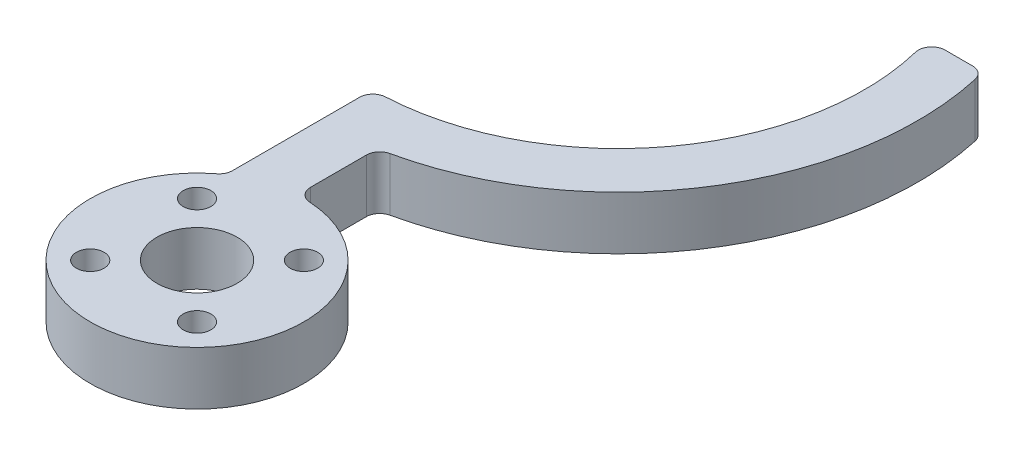
ISO-10303-21;
HEADER;
FILE_DESCRIPTION(('STEP AP214'),'2;1');
FILE_NAME('part.step','',(''),(''),'','','');
FILE_SCHEMA(('AUTOMOTIVE_DESIGN { 1 0 10303 214 1 1 1 1 }'));
ENDSEC;
DATA;
#1=APPLICATION_CONTEXT('core data for automotive mechanical design processes');
#2=APPLICATION_PROTOCOL_DEFINITION('international standard','automotive_design',2000,#1);
#3=PRODUCT_CONTEXT('',#1,'mechanical');
#4=PRODUCT('Part','Part','',(#3));
#5=PRODUCT_RELATED_PRODUCT_CATEGORY('part','',(#4));
#6=PRODUCT_DEFINITION_FORMATION('','',#4);
#7=PRODUCT_DEFINITION_CONTEXT('part definition',#1,'design');
#8=PRODUCT_DEFINITION('design','',#6,#7);
#9=PRODUCT_DEFINITION_SHAPE('','',#8);
#10=(LENGTH_UNIT() NAMED_UNIT(*) SI_UNIT(.MILLI.,.METRE.));
#11=(NAMED_UNIT(*) PLANE_ANGLE_UNIT() SI_UNIT($,.RADIAN.));
#12=(NAMED_UNIT(*) SI_UNIT($,.STERADIAN.) SOLID_ANGLE_UNIT());
#13=UNCERTAINTY_MEASURE_WITH_UNIT(LENGTH_MEASURE(1.E-05),#10,'distance_accuracy_value','');
#14=(GEOMETRIC_REPRESENTATION_CONTEXT(3) GLOBAL_UNCERTAINTY_ASSIGNED_CONTEXT((#13)) GLOBAL_UNIT_ASSIGNED_CONTEXT((#10,
#11,#12)) REPRESENTATION_CONTEXT('',''));
#15=CARTESIAN_POINT('',(0.,0.,0.));
#16=DIRECTION('',(0.,0.,1.));
#17=DIRECTION('',(1.,0.,0.));
#18=AXIS2_PLACEMENT_3D('',#15,#16,#17);
#19=CARTESIAN_POINT('',(8.96696536966746,8.,72.0811709693591));
#20=DIRECTION('',(0.,-1.,0.));
#21=DIRECTION('',(0.,0.,-1.));
#22=AXIS2_PLACEMENT_3D('',#19,#20,#21);
#23=CYLINDRICAL_SURFACE('',#22,16.);
#24=CARTESIAN_POINT('',(8.96696536966746,0.,72.0811709693591));
#25=DIRECTION('',(0.,1.,0.));
#26=DIRECTION('',(0.,0.,1.));
#27=AXIS2_PLACEMENT_3D('',#24,#25,#26);
#28=CIRCLE('',#27,16.);
#29=CARTESIAN_POINT('',(-0.781448292259167,0.,59.3938374797734));
#30=VERTEX_POINT('',#29);
#31=CARTESIAN_POINT('',(9.8852183744075,0.,56.1075423453023));
#32=VERTEX_POINT('',#31);
#33=EDGE_CURVE('E159',#30,#32,#28,.T.);
#34=ORIENTED_EDGE('',*,*,#33,.T.);
#35=DIRECTION('',(0.,-1.,0.));
#36=VECTOR('',#35,1.);
#37=CARTESIAN_POINT('',(9.8852183744075,8.,56.1075423453023));
#38=LINE('',#37,#36);
#39=CARTESIAN_POINT('',(9.8852183744075,8.,56.1075423453023));
#40=VERTEX_POINT('',#39);
#41=EDGE_CURVE('E180',#32,#40,#38,.F.);
#42=ORIENTED_EDGE('',*,*,#41,.T.);
#43=CARTESIAN_POINT('',(8.96696536966746,8.,72.0811709693591));
#44=DIRECTION('',(0.,1.,0.));
#45=DIRECTION('',(0.,0.,1.));
#46=AXIS2_PLACEMENT_3D('',#43,#44,#45);
#47=CIRCLE('',#46,16.);
#48=CARTESIAN_POINT('',(-0.781448292259167,8.,59.3938374797734));
#49=VERTEX_POINT('',#48);
#50=EDGE_CURVE('E284',#49,#40,#47,.T.);
#51=ORIENTED_EDGE('',*,*,#50,.F.);
#52=DIRECTION('',(0.,-1.,0.));
#53=VECTOR('',#52,1.);
#54=CARTESIAN_POINT('',(-0.781448292259167,8.,59.3938374797734));
#55=LINE('',#54,#53);
#56=EDGE_CURVE('E168',#49,#30,#55,.T.);
#57=ORIENTED_EDGE('',*,*,#56,.T.);
#58=EDGE_LOOP('',(#34,#42,#51,#57));
#59=FACE_BOUND('',#58,.T.);
#60=ADVANCED_FACE('F44',(#59),#23,.T.);
#61=CARTESIAN_POINT('',(8.00000000000002,8.,0.));
#62=DIRECTION('',(1.,0.,0.));
#63=DIRECTION('',(0.,0.,-1.));
#64=AXIS2_PLACEMENT_3D('',#61,#62,#63);
#65=PLANE('',#64);
#66=DIRECTION('',(0.,0.,1.));
#67=VECTOR('',#66,1.);
#68=CARTESIAN_POINT('',(8.00000000000002,8.,0.));
#69=LINE('',#68,#67);
#70=CARTESIAN_POINT('',(8.,8.,45.7498513658788));
#71=VERTEX_POINT('',#70);
#72=CARTESIAN_POINT('',(8.,8.,54.1108387672952));
#73=VERTEX_POINT('',#72);
#74=EDGE_CURVE('E288',#71,#73,#69,.T.);
#75=ORIENTED_EDGE('',*,*,#74,.T.);
#76=DIRECTION('',(0.,-1.,0.));
#77=VECTOR('',#76,1.);
#78=CARTESIAN_POINT('',(8.,8.,54.1108387672952));
#79=LINE('',#78,#77);
#80=CARTESIAN_POINT('',(8.,0.,54.1108387672952));
#81=VERTEX_POINT('',#80);
#82=EDGE_CURVE('E157',#73,#81,#79,.T.);
#83=ORIENTED_EDGE('',*,*,#82,.T.);
#84=DIRECTION('',(0.,0.,1.));
#85=VECTOR('',#84,1.);
#86=CARTESIAN_POINT('',(8.00000000000002,0.,0.));
#87=LINE('',#86,#85);
#88=CARTESIAN_POINT('',(8.,0.,45.7498513658788));
#89=VERTEX_POINT('',#88);
#90=EDGE_CURVE('E139',#89,#81,#87,.T.);
#91=ORIENTED_EDGE('',*,*,#90,.F.);
#92=DIRECTION('',(0.,-1.,0.));
#93=VECTOR('',#92,1.);
#94=CARTESIAN_POINT('',(8.,8.,45.7498513658788));
#95=LINE('',#94,#93);
#96=EDGE_CURVE('E154',#89,#71,#95,.F.);
#97=ORIENTED_EDGE('',*,*,#96,.T.);
#98=EDGE_LOOP('',(#75,#83,#91,#97));
#99=FACE_BOUND('',#98,.T.);
#100=ADVANCED_FACE('F153',(#99),#65,.T.);
#101=CARTESIAN_POINT('',(0.,8.,0.));
#102=DIRECTION('',(0.,-1.,0.));
#103=DIRECTION('',(0.,0.,-1.));
#104=AXIS2_PLACEMENT_3D('',#101,#102,#103);
#105=CYLINDRICAL_SURFACE('',#104,44.83);
#106=CARTESIAN_POINT('',(0.,0.,0.));
#107=DIRECTION('',(0.,1.,0.));
#108=DIRECTION('',(0.,0.,1.));
#109=AXIS2_PLACEMENT_3D('',#106,#107,#108);
#110=CIRCLE('',#109,44.83);
#111=CARTESIAN_POINT('',(9.57292333973949,0.,43.7959819930033));
#112=VERTEX_POINT('',#111);
#113=CARTESIAN_POINT('',(43.7826288002551,0.,-9.6338110495835));
#114=VERTEX_POINT('',#113);
#115=EDGE_CURVE('E141',#112,#114,#110,.T.);
#116=ORIENTED_EDGE('',*,*,#115,.T.);
#117=DIRECTION('',(0.,-1.,0.));
#118=VECTOR('',#117,1.);
#119=CARTESIAN_POINT('',(43.7826288002551,8.,-9.63381104958349));
#120=LINE('',#119,#118);
#121=CARTESIAN_POINT('',(43.7826288002551,8.,-9.6338110495835));
#122=VERTEX_POINT('',#121);
#123=EDGE_CURVE('E218',#114,#122,#120,.F.);
#124=ORIENTED_EDGE('',*,*,#123,.T.);
#125=CARTESIAN_POINT('',(0.,8.,0.));
#126=DIRECTION('',(0.,1.,0.));
#127=DIRECTION('',(0.,0.,1.));
#128=AXIS2_PLACEMENT_3D('',#125,#126,#127);
#129=CIRCLE('',#128,44.83);
#130=CARTESIAN_POINT('',(9.57292333973949,8.,43.7959819930033));
#131=VERTEX_POINT('',#130);
#132=EDGE_CURVE('E253',#131,#122,#129,.T.);
#133=ORIENTED_EDGE('',*,*,#132,.F.);
#134=DIRECTION('',(0.,-1.,0.));
#135=VECTOR('',#134,1.);
#136=CARTESIAN_POINT('',(9.57292333973949,8.,43.7959819930033));
#137=LINE('',#136,#135);
#138=EDGE_CURVE('E183',#131,#112,#137,.T.);
#139=ORIENTED_EDGE('',*,*,#138,.T.);
#140=EDGE_LOOP('',(#116,#124,#133,#139));
#141=FACE_BOUND('',#140,.T.);
#142=ADVANCED_FACE('F241',(#141),#105,.T.);
#143=CARTESIAN_POINT('',(0.,8.,0.));
#144=DIRECTION('',(0.,-1.,0.));
#145=DIRECTION('',(0.,0.,-1.));
#146=AXIS2_PLACEMENT_3D('',#143,#144,#145);
#147=CYLINDRICAL_SURFACE('',#146,36.83);
#148=CARTESIAN_POINT('',(0.,8.,0.));
#149=DIRECTION('',(0.,1.,0.));
#150=DIRECTION('',(0.,0.,1.));
#151=AXIS2_PLACEMENT_3D('',#148,#149,#150);
#152=CIRCLE('',#151,36.83);
#153=CARTESIAN_POINT('',(1.8969868658254,8.,36.7811139150364));
#154=VERTEX_POINT('',#153);
#155=CARTESIAN_POINT('',(35.7803977324483,8.,-8.72995063604655));
#156=VERTEX_POINT('',#155);
#157=EDGE_CURVE('E171',#154,#156,#152,.T.);
#158=ORIENTED_EDGE('',*,*,#157,.T.);
#159=DIRECTION('',(0.,-1.,0.));
#160=VECTOR('',#159,1.);
#161=CARTESIAN_POINT('',(35.7803977324483,8.,-8.72995063604655));
#162=LINE('',#161,#160);
#163=CARTESIAN_POINT('',(35.7803977324483,0.,-8.72995063604655));
#164=VERTEX_POINT('',#163);
#165=EDGE_CURVE('E11',#156,#164,#162,.T.);
#166=ORIENTED_EDGE('',*,*,#165,.T.);
#167=CARTESIAN_POINT('',(0.,0.,0.));
#168=DIRECTION('',(0.,1.,0.));
#169=DIRECTION('',(0.,0.,1.));
#170=AXIS2_PLACEMENT_3D('',#167,#168,#169);
#171=CIRCLE('',#170,36.83);
#172=CARTESIAN_POINT('',(1.8969868658254,0.,36.7811139150364));
#173=VERTEX_POINT('',#172);
#174=EDGE_CURVE('E245',#173,#164,#171,.T.);
#175=ORIENTED_EDGE('',*,*,#174,.F.);
#176=DIRECTION('',(0.,-1.,0.));
#177=VECTOR('',#176,1.);
#178=CARTESIAN_POINT('',(1.8969868658254,8.,36.7811139150364));
#179=LINE('',#178,#177);
#180=EDGE_CURVE('E196',#173,#154,#179,.F.);
#181=ORIENTED_EDGE('',*,*,#180,.T.);
#182=EDGE_LOOP('',(#158,#166,#175,#181));
#183=FACE_BOUND('',#182,.T.);
#184=ADVANCED_FACE('F356',(#183),#147,.F.);
#185=CARTESIAN_POINT('',(0.966965369667458,8.,80.0811709693591));
#186=DIRECTION('',(0.,-1.,0.));
#187=DIRECTION('',(0.,0.,-1.));
#188=AXIS2_PLACEMENT_3D('',#185,#186,#187);
#189=CYLINDRICAL_SURFACE('',#188,2.07500000000001);
#190=CARTESIAN_POINT('',(0.966965369667458,8.,80.0811709693591));
#191=DIRECTION('',(0.,1.,0.));
#192=DIRECTION('',(0.,0.,1.));
#193=AXIS2_PLACEMENT_3D('',#190,#191,#192);
#194=CIRCLE('',#193,2.07500000000001);
#195=CARTESIAN_POINT('',(0.966965369667458,8.,82.1561709693591));
#196=VERTEX_POINT('',#195);
#197=EDGE_CURVE('E280',#196,#196,#194,.T.);
#198=ORIENTED_EDGE('',*,*,#197,.T.);
#199=EDGE_LOOP('',(#198));
#200=FACE_BOUND('',#199,.T.);
#201=CARTESIAN_POINT('',(0.966965369667458,0.,80.0811709693591));
#202=DIRECTION('',(0.,1.,0.));
#203=DIRECTION('',(0.,0.,1.));
#204=AXIS2_PLACEMENT_3D('',#201,#202,#203);
#205=CIRCLE('',#204,2.07500000000001);
#206=CARTESIAN_POINT('',(0.966965369667458,0.,82.1561709693591));
#207=VERTEX_POINT('',#206);
#208=EDGE_CURVE('E306',#207,#207,#205,.T.);
#209=ORIENTED_EDGE('',*,*,#208,.F.);
#210=EDGE_LOOP('',(#209));
#211=FACE_BOUND('',#210,.T.);
#212=ADVANCED_FACE('F352',(#200,#211),#189,.F.);
#213=CARTESIAN_POINT('',(16.9669653696675,8.,80.0811709693591));
#214=DIRECTION('',(0.,-1.,0.));
#215=DIRECTION('',(0.,0.,-1.));
#216=AXIS2_PLACEMENT_3D('',#213,#214,#215);
#217=CYLINDRICAL_SURFACE('',#216,2.07500000000001);
#218=CARTESIAN_POINT('',(16.9669653696675,8.,80.0811709693591));
#219=DIRECTION('',(0.,1.,0.));
#220=DIRECTION('',(0.,0.,1.));
#221=AXIS2_PLACEMENT_3D('',#218,#219,#220);
#222=CIRCLE('',#221,2.07500000000001);
#223=CARTESIAN_POINT('',(16.9669653696675,8.,82.1561709693591));
#224=VERTEX_POINT('',#223);
#225=EDGE_CURVE('E276',#224,#224,#222,.T.);
#226=ORIENTED_EDGE('',*,*,#225,.T.);
#227=EDGE_LOOP('',(#226));
#228=FACE_BOUND('',#227,.T.);
#229=CARTESIAN_POINT('',(16.9669653696675,0.,80.0811709693591));
#230=DIRECTION('',(0.,1.,0.));
#231=DIRECTION('',(0.,0.,1.));
#232=AXIS2_PLACEMENT_3D('',#229,#230,#231);
#233=CIRCLE('',#232,2.07500000000001);
#234=CARTESIAN_POINT('',(16.9669653696675,0.,82.1561709693591));
#235=VERTEX_POINT('',#234);
#236=EDGE_CURVE('E302',#235,#235,#233,.T.);
#237=ORIENTED_EDGE('',*,*,#236,.F.);
#238=EDGE_LOOP('',(#237));
#239=FACE_BOUND('',#238,.T.);
#240=ADVANCED_FACE('F355',(#228,#239),#217,.F.);
#241=CARTESIAN_POINT('',(16.9669653696675,8.,64.0811709693591));
#242=DIRECTION('',(0.,-1.,0.));
#243=DIRECTION('',(0.,0.,-1.));
#244=AXIS2_PLACEMENT_3D('',#241,#242,#243);
#245=CYLINDRICAL_SURFACE('',#244,2.075);
#246=CARTESIAN_POINT('',(16.9669653696675,8.,64.0811709693591));
#247=DIRECTION('',(0.,1.,0.));
#248=DIRECTION('',(0.,0.,1.));
#249=AXIS2_PLACEMENT_3D('',#246,#247,#248);
#250=CIRCLE('',#249,2.075);
#251=CARTESIAN_POINT('',(16.9669653696675,8.,66.1561709693591));
#252=VERTEX_POINT('',#251);
#253=EDGE_CURVE('E272',#252,#252,#250,.T.);
#254=ORIENTED_EDGE('',*,*,#253,.T.);
#255=EDGE_LOOP('',(#254));
#256=FACE_BOUND('',#255,.T.);
#257=CARTESIAN_POINT('',(16.9669653696675,0.,64.0811709693591));
#258=DIRECTION('',(0.,1.,0.));
#259=DIRECTION('',(0.,0.,1.));
#260=AXIS2_PLACEMENT_3D('',#257,#258,#259);
#261=CIRCLE('',#260,2.075);
#262=CARTESIAN_POINT('',(16.9669653696675,0.,66.1561709693591));
#263=VERTEX_POINT('',#262);
#264=EDGE_CURVE('E298',#263,#263,#261,.T.);
#265=ORIENTED_EDGE('',*,*,#264,.F.);
#266=EDGE_LOOP('',(#265));
#267=FACE_BOUND('',#266,.T.);
#268=ADVANCED_FACE('F360',(#256,#267),#245,.F.);
#269=CARTESIAN_POINT('',(0.966965369667458,8.,64.0811709693591));
#270=DIRECTION('',(0.,-1.,0.));
#271=DIRECTION('',(0.,0.,-1.));
#272=AXIS2_PLACEMENT_3D('',#269,#270,#271);
#273=CYLINDRICAL_SURFACE('',#272,2.07500000000001);
#274=CARTESIAN_POINT('',(0.966965369667458,8.,64.0811709693591));
#275=DIRECTION('',(0.,1.,0.));
#276=DIRECTION('',(0.,0.,1.));
#277=AXIS2_PLACEMENT_3D('',#274,#275,#276);
#278=CIRCLE('',#277,2.07500000000001);
#279=CARTESIAN_POINT('',(0.966965369667458,8.,66.1561709693591));
#280=VERTEX_POINT('',#279);
#281=EDGE_CURVE('E268',#280,#280,#278,.T.);
#282=ORIENTED_EDGE('',*,*,#281,.T.);
#283=EDGE_LOOP('',(#282));
#284=FACE_BOUND('',#283,.T.);
#285=CARTESIAN_POINT('',(0.966965369667458,0.,64.0811709693591));
#286=DIRECTION('',(0.,1.,0.));
#287=DIRECTION('',(0.,0.,1.));
#288=AXIS2_PLACEMENT_3D('',#285,#286,#287);
#289=CIRCLE('',#288,2.07500000000001);
#290=CARTESIAN_POINT('',(0.966965369667458,0.,66.1561709693591));
#291=VERTEX_POINT('',#290);
#292=EDGE_CURVE('E261',#291,#291,#289,.T.);
#293=ORIENTED_EDGE('',*,*,#292,.F.);
#294=EDGE_LOOP('',(#293));
#295=FACE_BOUND('',#294,.T.);
#296=ADVANCED_FACE('F364',(#284,#295),#273,.F.);
#297=CARTESIAN_POINT('',(8.96696536966746,8.,72.0811709693591));
#298=DIRECTION('',(0.,-1.,0.));
#299=DIRECTION('',(0.,0.,-1.));
#300=AXIS2_PLACEMENT_3D('',#297,#298,#299);
#301=CYLINDRICAL_SURFACE('',#300,6.00320826308857);
#302=CARTESIAN_POINT('',(8.96696536966746,8.,72.0811709693591));
#303=DIRECTION('',(0.,1.,0.));
#304=DIRECTION('',(0.,0.,1.));
#305=AXIS2_PLACEMENT_3D('',#302,#303,#304);
#306=CIRCLE('',#305,6.00320826308857);
#307=CARTESIAN_POINT('',(8.96696536966746,8.,78.0843792324477));
#308=VERTEX_POINT('',#307);
#309=EDGE_CURVE('E264',#308,#308,#306,.T.);
#310=ORIENTED_EDGE('',*,*,#309,.T.);
#311=EDGE_LOOP('',(#310));
#312=FACE_BOUND('',#311,.T.);
#313=CARTESIAN_POINT('',(8.96696536966746,0.,72.0811709693591));
#314=DIRECTION('',(0.,1.,0.));
#315=DIRECTION('',(0.,0.,1.));
#316=AXIS2_PLACEMENT_3D('',#313,#314,#315);
#317=CIRCLE('',#316,6.00320826308857);
#318=CARTESIAN_POINT('',(8.96696536966746,0.,78.0843792324477));
#319=VERTEX_POINT('',#318);
#320=EDGE_CURVE('E257',#319,#319,#317,.T.);
#321=ORIENTED_EDGE('',*,*,#320,.F.);
#322=EDGE_LOOP('',(#321));
#323=FACE_BOUND('',#322,.T.);
#324=ADVANCED_FACE('F367',(#312,#323),#301,.F.);
#325=CARTESIAN_POINT('',(0.,8.,0.));
#326=DIRECTION('',(1.,0.,0.));
#327=DIRECTION('',(0.,0.,-1.));
#328=AXIS2_PLACEMENT_3D('',#325,#326,#327);
#329=PLANE('',#328);
#330=DIRECTION('',(0.,0.,1.));
#331=VECTOR('',#330,1.);
#332=CARTESIAN_POINT('',(0.,0.,0.));
#333=LINE('',#332,#331);
#334=CARTESIAN_POINT('',(0.,0.,38.7784592267408));
#335=VERTEX_POINT('',#334);
#336=CARTESIAN_POINT('',(0.,0.,57.8079207935752));
#337=VERTEX_POINT('',#336);
#338=EDGE_CURVE('E174',#335,#337,#333,.T.);
#339=ORIENTED_EDGE('',*,*,#338,.T.);
#340=DIRECTION('',(0.,1.,0.));
#341=VECTOR('',#340,1.);
#342=CARTESIAN_POINT('',(0.,8.,57.8079207935752));
#343=LINE('',#342,#341);
#344=CARTESIAN_POINT('',(0.,8.,57.8079207935752));
#345=VERTEX_POINT('',#344);
#346=EDGE_CURVE('E190',#337,#345,#343,.T.);
#347=ORIENTED_EDGE('',*,*,#346,.T.);
#348=DIRECTION('',(0.,0.,1.));
#349=VECTOR('',#348,1.);
#350=CARTESIAN_POINT('',(0.,8.,0.));
#351=LINE('',#350,#349);
#352=CARTESIAN_POINT('',(0.,8.,38.7784592267408));
#353=VERTEX_POINT('',#352);
#354=EDGE_CURVE('E164',#353,#345,#351,.T.);
#355=ORIENTED_EDGE('',*,*,#354,.F.);
#356=DIRECTION('',(0.,1.,0.));
#357=VECTOR('',#356,1.);
#358=CARTESIAN_POINT('',(0.,0.,38.7784592267408));
#359=LINE('',#358,#357);
#360=EDGE_CURVE('E186',#353,#335,#359,.F.);
#361=ORIENTED_EDGE('',*,*,#360,.T.);
#362=EDGE_LOOP('',(#339,#347,#355,#361));
#363=FACE_BOUND('',#362,.T.);
#364=ADVANCED_FACE('F319',(#363),#329,.F.);
#365=CARTESIAN_POINT('',(0.,8.,0.));
#366=DIRECTION('',(0.,1.,0.));
#367=DIRECTION('',(0.,0.,1.));
#368=AXIS2_PLACEMENT_3D('',#365,#366,#367);
#369=PLANE('',#368);
#370=ORIENTED_EDGE('',*,*,#132,.T.);
#371=CARTESIAN_POINT('',(41.8293551531324,8.,-9.20401800699668));
#372=DIRECTION('',(0.,1.,0.));
#373=DIRECTION('',(0.,0.,1.));
#374=AXIS2_PLACEMENT_3D('',#371,#372,#373);
#375=CIRCLE('',#374,2.);
#376=CARTESIAN_POINT('',(41.8293551531324,8.,-11.2040180069967));
#377=VERTEX_POINT('',#376);
#378=EDGE_CURVE('E225',#122,#377,#375,.T.);
#379=ORIENTED_EDGE('',*,*,#378,.T.);
#380=DIRECTION('',(1.,0.,0.));
#381=VECTOR('',#380,1.);
#382=CARTESIAN_POINT('',(44.7337261571492,8.,-11.2040180069967));
#383=LINE('',#382,#381);
#384=CARTESIAN_POINT('',(37.7234005960078,8.,-11.2040180069967));
#385=VERTEX_POINT('',#384);
#386=EDGE_CURVE('E252',#385,#377,#383,.T.);
#387=ORIENTED_EDGE('',*,*,#386,.F.);
#388=CARTESIAN_POINT('',(37.7234005960078,8.,-9.20401800699668));
#389=DIRECTION('',(0.,1.,0.));
#390=DIRECTION('',(0.,0.,1.));
#391=AXIS2_PLACEMENT_3D('',#388,#389,#390);
#392=CIRCLE('',#391,2.);
#393=EDGE_CURVE('E222',#385,#156,#392,.T.);
#394=ORIENTED_EDGE('',*,*,#393,.T.);
#395=ORIENTED_EDGE('',*,*,#157,.F.);
#396=CARTESIAN_POINT('',(2.,8.,38.7784592267408));
#397=DIRECTION('',(0.,1.,0.));
#398=DIRECTION('',(0.,0.,1.));
#399=AXIS2_PLACEMENT_3D('',#396,#397,#398);
#400=CIRCLE('',#399,2.);
#401=EDGE_CURVE('E199',#154,#353,#400,.T.);
#402=ORIENTED_EDGE('',*,*,#401,.T.);
#403=ORIENTED_EDGE('',*,*,#354,.T.);
#404=CARTESIAN_POINT('',(-1.99999999999999,8.,57.8079207935752));
#405=DIRECTION('',(0.,1.,0.));
#406=DIRECTION('',(0.,0.,1.));
#407=AXIS2_PLACEMENT_3D('',#404,#405,#406);
#408=CIRCLE('',#407,2.);
#409=EDGE_CURVE('E212',#345,#49,#408,.F.);
#410=ORIENTED_EDGE('',*,*,#409,.T.);
#411=ORIENTED_EDGE('',*,*,#50,.T.);
#412=CARTESIAN_POINT('',(10.,8.,54.1108387672952));
#413=DIRECTION('',(0.,1.,0.));
#414=DIRECTION('',(0.,0.,1.));
#415=AXIS2_PLACEMENT_3D('',#412,#413,#414);
#416=CIRCLE('',#415,2.);
#417=EDGE_CURVE('E148',#40,#73,#416,.F.);
#418=ORIENTED_EDGE('',*,*,#417,.T.);
#419=ORIENTED_EDGE('',*,*,#74,.F.);
#420=CARTESIAN_POINT('',(10.,8.,45.7498513658788));
#421=DIRECTION('',(0.,1.,0.));
#422=DIRECTION('',(0.,0.,1.));
#423=AXIS2_PLACEMENT_3D('',#420,#421,#422);
#424=CIRCLE('',#423,2.);
#425=EDGE_CURVE('E147',#71,#131,#424,.F.);
#426=ORIENTED_EDGE('',*,*,#425,.T.);
#427=EDGE_LOOP('',(#370,#379,#387,#394,#395,#402,#403,#410,#411,#418,#419,#426));
#428=FACE_BOUND('',#427,.T.);
#429=ORIENTED_EDGE('',*,*,#309,.F.);
#430=EDGE_LOOP('',(#429));
#431=FACE_BOUND('',#430,.T.);
#432=ORIENTED_EDGE('',*,*,#281,.F.);
#433=EDGE_LOOP('',(#432));
#434=FACE_BOUND('',#433,.T.);
#435=ORIENTED_EDGE('',*,*,#253,.F.);
#436=EDGE_LOOP('',(#435));
#437=FACE_BOUND('',#436,.T.);
#438=ORIENTED_EDGE('',*,*,#225,.F.);
#439=EDGE_LOOP('',(#438));
#440=FACE_BOUND('',#439,.T.);
#441=ORIENTED_EDGE('',*,*,#197,.F.);
#442=EDGE_LOOP('',(#441));
#443=FACE_BOUND('',#442,.T.);
#444=ADVANCED_FACE('F250',(#428,#431,#434,#437,#440,#443),#369,.T.);
#445=CARTESIAN_POINT('',(0.,0.,0.));
#446=DIRECTION('',(0.,1.,0.));
#447=DIRECTION('',(0.,0.,1.));
#448=AXIS2_PLACEMENT_3D('',#445,#446,#447);
#449=PLANE('',#448);
#450=ORIENTED_EDGE('',*,*,#320,.T.);
#451=EDGE_LOOP('',(#450));
#452=FACE_BOUND('',#451,.T.);
#453=ORIENTED_EDGE('',*,*,#292,.T.);
#454=EDGE_LOOP('',(#453));
#455=FACE_BOUND('',#454,.T.);
#456=ORIENTED_EDGE('',*,*,#264,.T.);
#457=EDGE_LOOP('',(#456));
#458=FACE_BOUND('',#457,.T.);
#459=ORIENTED_EDGE('',*,*,#236,.T.);
#460=EDGE_LOOP('',(#459));
#461=FACE_BOUND('',#460,.T.);
#462=ORIENTED_EDGE('',*,*,#208,.T.);
#463=EDGE_LOOP('',(#462));
#464=FACE_BOUND('',#463,.T.);
#465=DIRECTION('',(1.,0.,0.));
#466=VECTOR('',#465,1.);
#467=CARTESIAN_POINT('',(0.,0.,-11.2040180069967));
#468=LINE('',#467,#466);
#469=CARTESIAN_POINT('',(37.7234005960078,0.,-11.2040180069967));
#470=VERTEX_POINT('',#469);
#471=CARTESIAN_POINT('',(41.8293551531324,0.,-11.2040180069967));
#472=VERTEX_POINT('',#471);
#473=EDGE_CURVE('E215',#470,#472,#468,.T.);
#474=ORIENTED_EDGE('',*,*,#473,.T.);
#475=CARTESIAN_POINT('',(41.8293551531324,0.,-9.20401800699668));
#476=DIRECTION('',(0.,1.,0.));
#477=DIRECTION('',(0.,0.,1.));
#478=AXIS2_PLACEMENT_3D('',#475,#476,#477);
#479=CIRCLE('',#478,2.);
#480=EDGE_CURVE('E53',#472,#114,#479,.F.);
#481=ORIENTED_EDGE('',*,*,#480,.T.);
#482=ORIENTED_EDGE('',*,*,#115,.F.);
#483=CARTESIAN_POINT('',(10.,0.,45.7498513658788));
#484=DIRECTION('',(0.,1.,0.));
#485=DIRECTION('',(0.,0.,1.));
#486=AXIS2_PLACEMENT_3D('',#483,#484,#485);
#487=CIRCLE('',#486,2.);
#488=EDGE_CURVE('E136',#112,#89,#487,.T.);
#489=ORIENTED_EDGE('',*,*,#488,.T.);
#490=ORIENTED_EDGE('',*,*,#90,.T.);
#491=CARTESIAN_POINT('',(10.,0.,54.1108387672952));
#492=DIRECTION('',(0.,1.,0.));
#493=DIRECTION('',(0.,0.,1.));
#494=AXIS2_PLACEMENT_3D('',#491,#492,#493);
#495=CIRCLE('',#494,2.);
#496=EDGE_CURVE('E202',#81,#32,#495,.T.);
#497=ORIENTED_EDGE('',*,*,#496,.T.);
#498=ORIENTED_EDGE('',*,*,#33,.F.);
#499=CARTESIAN_POINT('',(-1.99999999999999,0.,57.8079207935752));
#500=DIRECTION('',(0.,1.,0.));
#501=DIRECTION('',(0.,0.,1.));
#502=AXIS2_PLACEMENT_3D('',#499,#500,#501);
#503=CIRCLE('',#502,2.);
#504=EDGE_CURVE('E209',#30,#337,#503,.T.);
#505=ORIENTED_EDGE('',*,*,#504,.T.);
#506=ORIENTED_EDGE('',*,*,#338,.F.);
#507=CARTESIAN_POINT('',(2.,0.,38.7784592267408));
#508=DIRECTION('',(0.,1.,0.));
#509=DIRECTION('',(0.,0.,1.));
#510=AXIS2_PLACEMENT_3D('',#507,#508,#509);
#511=CIRCLE('',#510,2.);
#512=EDGE_CURVE('E193',#335,#173,#511,.F.);
#513=ORIENTED_EDGE('',*,*,#512,.T.);
#514=ORIENTED_EDGE('',*,*,#174,.T.);
#515=CARTESIAN_POINT('',(37.7234005960078,0.,-9.20401800699668));
#516=DIRECTION('',(0.,1.,0.));
#517=DIRECTION('',(0.,0.,1.));
#518=AXIS2_PLACEMENT_3D('',#515,#516,#517);
#519=CIRCLE('',#518,2.);
#520=EDGE_CURVE('E234',#164,#470,#519,.F.);
#521=ORIENTED_EDGE('',*,*,#520,.T.);
#522=EDGE_LOOP('',(#474,#481,#482,#489,#490,#497,#498,#505,#506,#513,#514,#521));
#523=FACE_BOUND('',#522,.T.);
#524=ADVANCED_FACE('F138',(#452,#455,#458,#461,#464,#523),#449,.F.);
#525=CARTESIAN_POINT('',(10.,8.,54.1108387672952));
#526=DIRECTION('',(0.,-1.,0.));
#527=DIRECTION('',(0.,0.,-1.));
#528=AXIS2_PLACEMENT_3D('',#525,#526,#527);
#529=CYLINDRICAL_SURFACE('',#528,2.);
#530=ORIENTED_EDGE('',*,*,#417,.F.);
#531=ORIENTED_EDGE('',*,*,#41,.F.);
#532=ORIENTED_EDGE('',*,*,#496,.F.);
#533=ORIENTED_EDGE('',*,*,#82,.F.);
#534=EDGE_LOOP('',(#530,#531,#532,#533));
#535=FACE_BOUND('',#534,.T.);
#536=ADVANCED_FACE('F332',(#535),#529,.F.);
#537=CARTESIAN_POINT('',(10.,8.,45.7498513658788));
#538=DIRECTION('',(0.,-1.,0.));
#539=DIRECTION('',(0.,0.,-1.));
#540=AXIS2_PLACEMENT_3D('',#537,#538,#539);
#541=CYLINDRICAL_SURFACE('',#540,2.);
#542=ORIENTED_EDGE('',*,*,#425,.F.);
#543=ORIENTED_EDGE('',*,*,#96,.F.);
#544=ORIENTED_EDGE('',*,*,#488,.F.);
#545=ORIENTED_EDGE('',*,*,#138,.F.);
#546=EDGE_LOOP('',(#542,#543,#544,#545));
#547=FACE_BOUND('',#546,.T.);
#548=ADVANCED_FACE('F162',(#547),#541,.F.);
#549=CARTESIAN_POINT('',(-1.99999999999999,8.,57.8079207935752));
#550=DIRECTION('',(0.,-1.,0.));
#551=DIRECTION('',(0.,0.,-1.));
#552=AXIS2_PLACEMENT_3D('',#549,#550,#551);
#553=CYLINDRICAL_SURFACE('',#552,2.);
#554=ORIENTED_EDGE('',*,*,#409,.F.);
#555=ORIENTED_EDGE('',*,*,#346,.F.);
#556=ORIENTED_EDGE('',*,*,#504,.F.);
#557=ORIENTED_EDGE('',*,*,#56,.F.);
#558=EDGE_LOOP('',(#554,#555,#556,#557));
#559=FACE_BOUND('',#558,.T.);
#560=ADVANCED_FACE('F324',(#559),#553,.F.);
#561=CARTESIAN_POINT('',(2.,8.,38.7784592267408));
#562=DIRECTION('',(0.,-1.,0.));
#563=DIRECTION('',(0.,0.,-1.));
#564=AXIS2_PLACEMENT_3D('',#561,#562,#563);
#565=CYLINDRICAL_SURFACE('',#564,2.);
#566=ORIENTED_EDGE('',*,*,#401,.F.);
#567=ORIENTED_EDGE('',*,*,#180,.F.);
#568=ORIENTED_EDGE('',*,*,#512,.F.);
#569=ORIENTED_EDGE('',*,*,#360,.F.);
#570=EDGE_LOOP('',(#566,#567,#568,#569));
#571=FACE_BOUND('',#570,.T.);
#572=ADVANCED_FACE('F412',(#571),#565,.T.);
#573=CARTESIAN_POINT('',(44.7337261571492,-2.,-11.2040180069967));
#574=DIRECTION('',(0.,0.,1.));
#575=DIRECTION('',(1.,0.,0.));
#576=AXIS2_PLACEMENT_3D('',#573,#574,#575);
#577=PLANE('',#576);
#578=ORIENTED_EDGE('',*,*,#386,.T.);
#579=DIRECTION('',(0.,-1.,0.));
#580=VECTOR('',#579,1.);
#581=CARTESIAN_POINT('',(41.8293551531324,-2.,-11.2040180069967));
#582=LINE('',#581,#580);
#583=EDGE_CURVE('E66',#377,#472,#582,.T.);
#584=ORIENTED_EDGE('',*,*,#583,.T.);
#585=ORIENTED_EDGE('',*,*,#473,.F.);
#586=DIRECTION('',(0.,1.,0.));
#587=VECTOR('',#586,1.);
#588=CARTESIAN_POINT('',(37.7234005960078,8.,-11.2040180069967));
#589=LINE('',#588,#587);
#590=EDGE_CURVE('E228',#470,#385,#589,.T.);
#591=ORIENTED_EDGE('',*,*,#590,.T.);
#592=EDGE_LOOP('',(#578,#584,#585,#591));
#593=FACE_BOUND('',#592,.T.);
#594=ADVANCED_FACE('F254',(#593),#577,.F.);
#595=CARTESIAN_POINT('',(41.8293551531324,8.,-9.20401800699668));
#596=DIRECTION('',(0.,-1.,0.));
#597=DIRECTION('',(0.,0.,-1.));
#598=AXIS2_PLACEMENT_3D('',#595,#596,#597);
#599=CYLINDRICAL_SURFACE('',#598,2.);
#600=ORIENTED_EDGE('',*,*,#480,.F.);
#601=ORIENTED_EDGE('',*,*,#583,.F.);
#602=ORIENTED_EDGE('',*,*,#378,.F.);
#603=ORIENTED_EDGE('',*,*,#123,.F.);
#604=EDGE_LOOP('',(#600,#601,#602,#603));
#605=FACE_BOUND('',#604,.T.);
#606=ADVANCED_FACE('F247',(#605),#599,.T.);
#607=CARTESIAN_POINT('',(37.7234005960078,8.,-9.20401800699668));
#608=DIRECTION('',(0.,-1.,0.));
#609=DIRECTION('',(0.,0.,-1.));
#610=AXIS2_PLACEMENT_3D('',#607,#608,#609);
#611=CYLINDRICAL_SURFACE('',#610,2.);
#612=ORIENTED_EDGE('',*,*,#520,.F.);
#613=ORIENTED_EDGE('',*,*,#165,.F.);
#614=ORIENTED_EDGE('',*,*,#393,.F.);
#615=ORIENTED_EDGE('',*,*,#590,.F.);
#616=EDGE_LOOP('',(#612,#613,#614,#615));
#617=FACE_BOUND('',#616,.T.);
#618=ADVANCED_FACE('F46',(#617),#611,.T.);
#619=CLOSED_SHELL('',(#60,#100,#142,#184,#212,#240,#268,#296,#324,#364,#444,#524,#536,#548,#560,
#572,#594,#606,#618));
#620=MANIFOLD_SOLID_BREP('B2',#619);
#621=ADVANCED_BREP_SHAPE_REPRESENTATION('',(#18,#620),#14);
#622=SHAPE_DEFINITION_REPRESENTATION(#9,#621);
ENDSEC;
END-ISO-10303-21;
